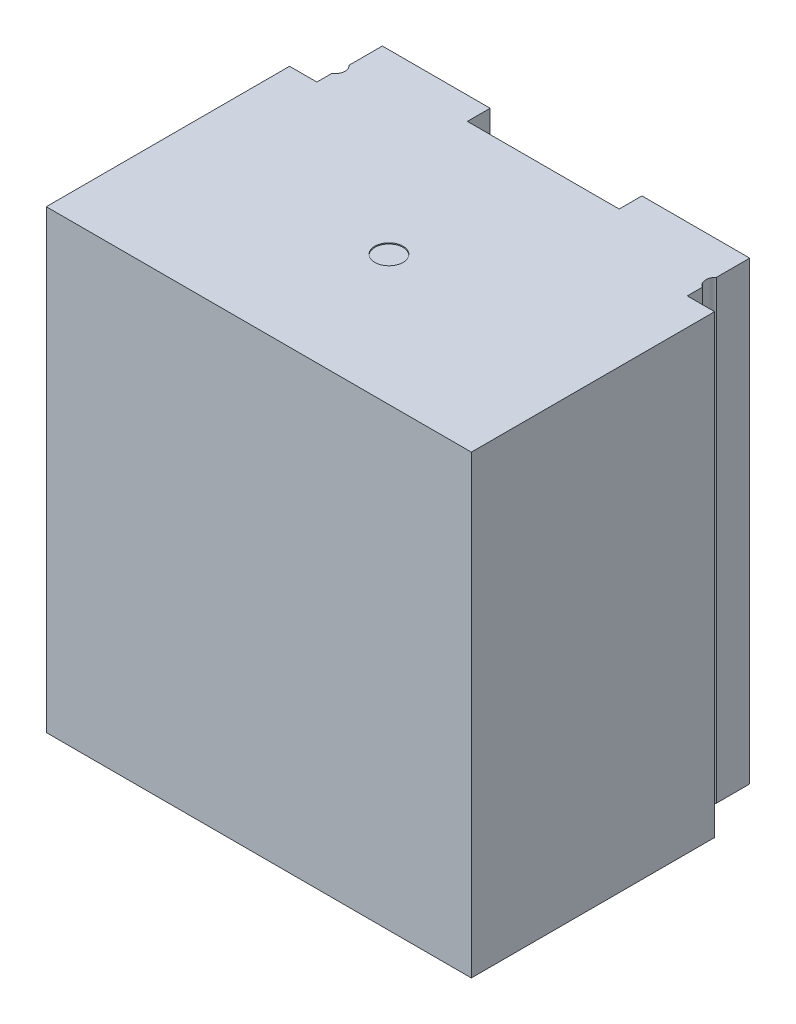
ISO-10303-21;
HEADER;
FILE_DESCRIPTION(('STEP AP214'),'2;1');
FILE_NAME('part.step','',(''),(''),'','','');
FILE_SCHEMA(('AUTOMOTIVE_DESIGN { 1 0 10303 214 1 1 1 1 }'));
ENDSEC;
DATA;
#1=APPLICATION_CONTEXT('core data for automotive mechanical design processes');
#2=APPLICATION_PROTOCOL_DEFINITION('international standard','automotive_design',2000,#1);
#3=PRODUCT_CONTEXT('',#1,'mechanical');
#4=PRODUCT('Part','Part','',(#3));
#5=PRODUCT_RELATED_PRODUCT_CATEGORY('part','',(#4));
#6=PRODUCT_DEFINITION_FORMATION('','',#4);
#7=PRODUCT_DEFINITION_CONTEXT('part definition',#1,'design');
#8=PRODUCT_DEFINITION('design','',#6,#7);
#9=PRODUCT_DEFINITION_SHAPE('','',#8);
#10=(LENGTH_UNIT() NAMED_UNIT(*) SI_UNIT(.MILLI.,.METRE.));
#11=(NAMED_UNIT(*) PLANE_ANGLE_UNIT() SI_UNIT($,.RADIAN.));
#12=(NAMED_UNIT(*) SI_UNIT($,.STERADIAN.) SOLID_ANGLE_UNIT());
#13=UNCERTAINTY_MEASURE_WITH_UNIT(LENGTH_MEASURE(1.E-05),#10,'distance_accuracy_value','');
#14=(GEOMETRIC_REPRESENTATION_CONTEXT(3) GLOBAL_UNCERTAINTY_ASSIGNED_CONTEXT((#13)) GLOBAL_UNIT_ASSIGNED_CONTEXT((#10,
#11,#12)) REPRESENTATION_CONTEXT('',''));
#15=CARTESIAN_POINT('',(0.,0.,0.));
#16=DIRECTION('',(0.,0.,1.));
#17=DIRECTION('',(1.,0.,0.));
#18=AXIS2_PLACEMENT_3D('',#15,#16,#17);
#19=CARTESIAN_POINT('',(120.904,129.54,-10.8709798683375));
#20=DIRECTION('',(-1.,0.,0.));
#21=DIRECTION('',(0.,0.,1.));
#22=AXIS2_PLACEMENT_3D('',#19,#20,#21);
#23=PLANE('',#22);
#24=DIRECTION('',(0.,0.,-1.));
#25=VECTOR('',#24,1.);
#26=CARTESIAN_POINT('',(120.904,22.86,-10.8709798683375));
#27=LINE('',#26,#25);
#28=CARTESIAN_POINT('',(120.904,22.86,6.90902013166253));
#29=VERTEX_POINT('',#28);
#30=CARTESIAN_POINT('',(120.904,22.86,-50.0709798683375));
#31=VERTEX_POINT('',#30);
#32=EDGE_CURVE('E172',#29,#31,#27,.T.);
#33=ORIENTED_EDGE('',*,*,#32,.T.);
#34=DIRECTION('',(0.,-1.,0.));
#35=VECTOR('',#34,1.);
#36=CARTESIAN_POINT('',(120.904,129.54,-50.0709798683375));
#37=LINE('',#36,#35);
#38=CARTESIAN_POINT('',(120.904,129.54,-50.0709798683375));
#39=VERTEX_POINT('',#38);
#40=EDGE_CURVE('E11',#39,#31,#37,.T.);
#41=ORIENTED_EDGE('',*,*,#40,.F.);
#42=DIRECTION('',(0.,0.,-1.));
#43=VECTOR('',#42,1.);
#44=CARTESIAN_POINT('',(120.904,129.54,-10.8709798683375));
#45=LINE('',#44,#43);
#46=CARTESIAN_POINT('',(120.904,129.54,6.90902013166253));
#47=VERTEX_POINT('',#46);
#48=EDGE_CURVE('E112',#47,#39,#45,.T.);
#49=ORIENTED_EDGE('',*,*,#48,.F.);
#50=DIRECTION('',(0.,1.,0.));
#51=VECTOR('',#50,1.);
#52=CARTESIAN_POINT('',(120.904,22.86,6.90902013166253));
#53=LINE('',#52,#51);
#54=EDGE_CURVE('E299',#29,#47,#53,.T.);
#55=ORIENTED_EDGE('',*,*,#54,.F.);
#56=EDGE_LOOP('',(#33,#41,#49,#55));
#57=FACE_BOUND('',#56,.T.);
#58=ADVANCED_FACE('F34',(#57),#23,.F.);
#59=CARTESIAN_POINT('',(120.904,129.54,-50.0709798683375));
#60=DIRECTION('',(0.,0.,1.));
#61=DIRECTION('',(1.,0.,0.));
#62=AXIS2_PLACEMENT_3D('',#59,#60,#61);
#63=PLANE('',#62);
#64=DIRECTION('',(-1.,0.,0.));
#65=VECTOR('',#64,1.);
#66=CARTESIAN_POINT('',(120.904,22.86,-50.0709798683375));
#67=LINE('',#66,#65);
#68=CARTESIAN_POINT('',(114.5032,22.86,-50.0709798683375));
#69=VERTEX_POINT('',#68);
#70=EDGE_CURVE('E174',#31,#69,#67,.T.);
#71=ORIENTED_EDGE('',*,*,#70,.T.);
#72=DIRECTION('',(0.,-1.,0.));
#73=VECTOR('',#72,1.);
#74=CARTESIAN_POINT('',(114.5032,129.54,-50.0709798683375));
#75=LINE('',#74,#73);
#76=CARTESIAN_POINT('',(114.5032,129.54,-50.0709798683375));
#77=VERTEX_POINT('',#76);
#78=EDGE_CURVE('E42',#77,#69,#75,.T.);
#79=ORIENTED_EDGE('',*,*,#78,.F.);
#80=DIRECTION('',(-1.,0.,0.));
#81=VECTOR('',#80,1.);
#82=CARTESIAN_POINT('',(120.904,129.54,-50.0709798683375));
#83=LINE('',#82,#81);
#84=EDGE_CURVE('E305',#39,#77,#83,.T.);
#85=ORIENTED_EDGE('',*,*,#84,.F.);
#86=ORIENTED_EDGE('',*,*,#40,.T.);
#87=EDGE_LOOP('',(#71,#79,#85,#86));
#88=FACE_BOUND('',#87,.T.);
#89=ADVANCED_FACE('F306',(#88),#63,.F.);
#90=CARTESIAN_POINT('',(114.5032,129.54,-50.0709798683375));
#91=DIRECTION('',(-1.,0.,0.));
#92=DIRECTION('',(0.,0.,1.));
#93=AXIS2_PLACEMENT_3D('',#90,#91,#92);
#94=PLANE('',#93);
#95=DIRECTION('',(0.,0.,-1.));
#96=VECTOR('',#95,1.);
#97=CARTESIAN_POINT('',(114.5032,22.86,-50.0709798683375));
#98=LINE('',#97,#96);
#99=CARTESIAN_POINT('',(114.5032,22.86,-53.6269798683375));
#100=VERTEX_POINT('',#99);
#101=EDGE_CURVE('E177',#69,#100,#98,.T.);
#102=ORIENTED_EDGE('',*,*,#101,.T.);
#103=DIRECTION('',(0.,-1.,0.));
#104=VECTOR('',#103,1.);
#105=CARTESIAN_POINT('',(114.5032,129.54,-53.6269798683375));
#106=LINE('',#105,#104);
#107=CARTESIAN_POINT('',(114.5032,129.54,-53.6269798683375));
#108=VERTEX_POINT('',#107);
#109=EDGE_CURVE('E225',#108,#100,#106,.T.);
#110=ORIENTED_EDGE('',*,*,#109,.F.);
#111=DIRECTION('',(0.,0.,-1.));
#112=VECTOR('',#111,1.);
#113=CARTESIAN_POINT('',(114.5032,129.54,-50.0709798683375));
#114=LINE('',#113,#112);
#115=EDGE_CURVE('E234',#77,#108,#114,.T.);
#116=ORIENTED_EDGE('',*,*,#115,.F.);
#117=ORIENTED_EDGE('',*,*,#78,.T.);
#118=EDGE_LOOP('',(#102,#110,#116,#117));
#119=FACE_BOUND('',#118,.T.);
#120=ADVANCED_FACE('F232',(#119),#94,.F.);
#121=CARTESIAN_POINT('',(115.609765974355,129.54,-55.5544180630403));
#122=DIRECTION('',(0.,-1.,0.));
#123=DIRECTION('',(0.,0.,-1.));
#124=AXIS2_PLACEMENT_3D('',#121,#122,#123);
#125=CYLINDRICAL_SURFACE('',#124,2.2225);
#126=CARTESIAN_POINT('',(115.609765974355,22.86,-55.5544180630403));
#127=DIRECTION('',(0.,-1.,0.));
#128=DIRECTION('',(0.,0.,-1.));
#129=AXIS2_PLACEMENT_3D('',#126,#127,#128);
#130=CIRCLE('',#129,2.2225);
#131=CARTESIAN_POINT('',(114.1476,22.86,-57.2282092427989));
#132=VERTEX_POINT('',#131);
#133=EDGE_CURVE('E179',#100,#132,#130,.T.);
#134=ORIENTED_EDGE('',*,*,#133,.T.);
#135=DIRECTION('',(0.,-1.,0.));
#136=VECTOR('',#135,1.);
#137=CARTESIAN_POINT('',(114.1476,129.54,-57.2282092427989));
#138=LINE('',#137,#136);
#139=CARTESIAN_POINT('',(114.1476,129.54,-57.2282092427989));
#140=VERTEX_POINT('',#139);
#141=EDGE_CURVE('E222',#140,#132,#138,.T.);
#142=ORIENTED_EDGE('',*,*,#141,.F.);
#143=CARTESIAN_POINT('',(115.609765974355,129.54,-55.5544180630403));
#144=DIRECTION('',(0.,-1.,0.));
#145=DIRECTION('',(0.,0.,-1.));
#146=AXIS2_PLACEMENT_3D('',#143,#144,#145);
#147=CIRCLE('',#146,2.2225);
#148=EDGE_CURVE('E255',#108,#140,#147,.T.);
#149=ORIENTED_EDGE('',*,*,#148,.F.);
#150=ORIENTED_EDGE('',*,*,#109,.T.);
#151=EDGE_LOOP('',(#134,#142,#149,#150));
#152=FACE_BOUND('',#151,.T.);
#153=ADVANCED_FACE('F246',(#152),#125,.F.);
#154=CARTESIAN_POINT('',(114.1476,129.54,-57.2282092427989));
#155=DIRECTION('',(-1.,0.,0.));
#156=DIRECTION('',(0.,0.,1.));
#157=AXIS2_PLACEMENT_3D('',#154,#155,#156);
#158=PLANE('',#157);
#159=DIRECTION('',(0.,0.,-1.));
#160=VECTOR('',#159,1.);
#161=CARTESIAN_POINT('',(114.1476,22.86,-57.2282092427989));
#162=LINE('',#161,#160);
#163=CARTESIAN_POINT('',(114.1476,22.86,-65.0514092427989));
#164=VERTEX_POINT('',#163);
#165=EDGE_CURVE('E181',#132,#164,#162,.T.);
#166=ORIENTED_EDGE('',*,*,#165,.T.);
#167=DIRECTION('',(0.,-1.,0.));
#168=VECTOR('',#167,1.);
#169=CARTESIAN_POINT('',(114.1476,129.54,-65.0514092427989));
#170=LINE('',#169,#168);
#171=CARTESIAN_POINT('',(114.1476,129.54,-65.0514092427989));
#172=VERTEX_POINT('',#171);
#173=EDGE_CURVE('E219',#172,#164,#170,.T.);
#174=ORIENTED_EDGE('',*,*,#173,.F.);
#175=DIRECTION('',(0.,0.,-1.));
#176=VECTOR('',#175,1.);
#177=CARTESIAN_POINT('',(114.1476,129.54,-57.2282092427989));
#178=LINE('',#177,#176);
#179=EDGE_CURVE('E252',#140,#172,#178,.T.);
#180=ORIENTED_EDGE('',*,*,#179,.F.);
#181=ORIENTED_EDGE('',*,*,#141,.T.);
#182=EDGE_LOOP('',(#166,#174,#180,#181));
#183=FACE_BOUND('',#182,.T.);
#184=ADVANCED_FACE('F250',(#183),#158,.F.);
#185=CARTESIAN_POINT('',(114.1476,129.54,-65.0514092427989));
#186=DIRECTION('',(0.,0.,1.));
#187=DIRECTION('',(1.,0.,0.));
#188=AXIS2_PLACEMENT_3D('',#185,#186,#187);
#189=PLANE('',#188);
#190=DIRECTION('',(-1.,0.,0.));
#191=VECTOR('',#190,1.);
#192=CARTESIAN_POINT('',(114.1476,22.86,-65.0514092427989));
#193=LINE('',#192,#191);
#194=CARTESIAN_POINT('',(88.9,22.86,-65.0514092427989));
#195=VERTEX_POINT('',#194);
#196=EDGE_CURVE('E183',#164,#195,#193,.T.);
#197=ORIENTED_EDGE('',*,*,#196,.T.);
#198=DIRECTION('',(0.,-1.,0.));
#199=VECTOR('',#198,1.);
#200=CARTESIAN_POINT('',(88.9,129.54,-65.0514092427989));
#201=LINE('',#200,#199);
#202=CARTESIAN_POINT('',(88.9,129.54,-65.0514092427989));
#203=VERTEX_POINT('',#202);
#204=EDGE_CURVE('E216',#203,#195,#201,.T.);
#205=ORIENTED_EDGE('',*,*,#204,.F.);
#206=DIRECTION('',(-1.,0.,0.));
#207=VECTOR('',#206,1.);
#208=CARTESIAN_POINT('',(114.1476,129.54,-65.0514092427989));
#209=LINE('',#208,#207);
#210=EDGE_CURVE('E254',#172,#203,#209,.T.);
#211=ORIENTED_EDGE('',*,*,#210,.F.);
#212=ORIENTED_EDGE('',*,*,#173,.T.);
#213=EDGE_LOOP('',(#197,#205,#211,#212));
#214=FACE_BOUND('',#213,.T.);
#215=ADVANCED_FACE('F339',(#214),#189,.F.);
#216=CARTESIAN_POINT('',(88.9,129.54,-65.0514092427989));
#217=DIRECTION('',(1.,0.,0.));
#218=DIRECTION('',(0.,0.,-1.));
#219=AXIS2_PLACEMENT_3D('',#216,#217,#218);
#220=PLANE('',#219);
#221=DIRECTION('',(0.,0.,1.));
#222=VECTOR('',#221,1.);
#223=CARTESIAN_POINT('',(88.9,22.86,-65.0514092427989));
#224=LINE('',#223,#222);
#225=CARTESIAN_POINT('',(88.9,22.86,-59.7174092427989));
#226=VERTEX_POINT('',#225);
#227=EDGE_CURVE('E185',#195,#226,#224,.T.);
#228=ORIENTED_EDGE('',*,*,#227,.T.);
#229=DIRECTION('',(0.,-1.,0.));
#230=VECTOR('',#229,1.);
#231=CARTESIAN_POINT('',(88.9,129.54,-59.7174092427989));
#232=LINE('',#231,#230);
#233=CARTESIAN_POINT('',(88.9,129.54,-59.7174092427989));
#234=VERTEX_POINT('',#233);
#235=EDGE_CURVE('E213',#234,#226,#232,.T.);
#236=ORIENTED_EDGE('',*,*,#235,.F.);
#237=DIRECTION('',(0.,0.,1.));
#238=VECTOR('',#237,1.);
#239=CARTESIAN_POINT('',(88.9,129.54,-65.0514092427989));
#240=LINE('',#239,#238);
#241=EDGE_CURVE('E257',#203,#234,#240,.T.);
#242=ORIENTED_EDGE('',*,*,#241,.F.);
#243=ORIENTED_EDGE('',*,*,#204,.T.);
#244=EDGE_LOOP('',(#228,#236,#242,#243));
#245=FACE_BOUND('',#244,.T.);
#246=ADVANCED_FACE('F342',(#245),#220,.F.);
#247=CARTESIAN_POINT('',(88.9,129.54,-59.7174092427989));
#248=DIRECTION('',(0.,0.,1.));
#249=DIRECTION('',(1.,0.,0.));
#250=AXIS2_PLACEMENT_3D('',#247,#248,#249);
#251=PLANE('',#250);
#252=DIRECTION('',(-1.,0.,0.));
#253=VECTOR('',#252,1.);
#254=CARTESIAN_POINT('',(88.9,22.86,-59.7174092427989));
#255=LINE('',#254,#253);
#256=CARTESIAN_POINT('',(53.34,22.86,-59.7174092427989));
#257=VERTEX_POINT('',#256);
#258=EDGE_CURVE('E187',#226,#257,#255,.T.);
#259=ORIENTED_EDGE('',*,*,#258,.T.);
#260=DIRECTION('',(0.,-1.,0.));
#261=VECTOR('',#260,1.);
#262=CARTESIAN_POINT('',(53.34,129.54,-59.7174092427989));
#263=LINE('',#262,#261);
#264=CARTESIAN_POINT('',(53.34,129.54,-59.7174092427989));
#265=VERTEX_POINT('',#264);
#266=EDGE_CURVE('E210',#265,#257,#263,.T.);
#267=ORIENTED_EDGE('',*,*,#266,.F.);
#268=DIRECTION('',(-1.,0.,0.));
#269=VECTOR('',#268,1.);
#270=CARTESIAN_POINT('',(88.9,129.54,-59.7174092427989));
#271=LINE('',#270,#269);
#272=EDGE_CURVE('E263',#234,#265,#271,.T.);
#273=ORIENTED_EDGE('',*,*,#272,.F.);
#274=ORIENTED_EDGE('',*,*,#235,.T.);
#275=EDGE_LOOP('',(#259,#267,#273,#274));
#276=FACE_BOUND('',#275,.T.);
#277=ADVANCED_FACE('F346',(#276),#251,.F.);
#278=CARTESIAN_POINT('',(53.34,129.54,-59.7174092427989));
#279=DIRECTION('',(-1.,0.,0.));
#280=DIRECTION('',(0.,0.,1.));
#281=AXIS2_PLACEMENT_3D('',#278,#279,#280);
#282=PLANE('',#281);
#283=DIRECTION('',(0.,0.,-1.));
#284=VECTOR('',#283,1.);
#285=CARTESIAN_POINT('',(53.34,22.86,-59.7174092427989));
#286=LINE('',#285,#284);
#287=CARTESIAN_POINT('',(53.34,22.86,-65.0514092427989));
#288=VERTEX_POINT('',#287);
#289=EDGE_CURVE('E189',#257,#288,#286,.T.);
#290=ORIENTED_EDGE('',*,*,#289,.T.);
#291=DIRECTION('',(0.,-1.,0.));
#292=VECTOR('',#291,1.);
#293=CARTESIAN_POINT('',(53.34,129.54,-65.0514092427989));
#294=LINE('',#293,#292);
#295=CARTESIAN_POINT('',(53.34,129.54,-65.0514092427989));
#296=VERTEX_POINT('',#295);
#297=EDGE_CURVE('E207',#296,#288,#294,.T.);
#298=ORIENTED_EDGE('',*,*,#297,.F.);
#299=DIRECTION('',(0.,0.,-1.));
#300=VECTOR('',#299,1.);
#301=CARTESIAN_POINT('',(53.34,129.54,-59.7174092427989));
#302=LINE('',#301,#300);
#303=EDGE_CURVE('E265',#265,#296,#302,.T.);
#304=ORIENTED_EDGE('',*,*,#303,.F.);
#305=ORIENTED_EDGE('',*,*,#266,.T.);
#306=EDGE_LOOP('',(#290,#298,#304,#305));
#307=FACE_BOUND('',#306,.T.);
#308=ADVANCED_FACE('F350',(#307),#282,.F.);
#309=CARTESIAN_POINT('',(53.34,129.54,-65.0514092427989));
#310=DIRECTION('',(0.,0.,1.));
#311=DIRECTION('',(1.,0.,0.));
#312=AXIS2_PLACEMENT_3D('',#309,#310,#311);
#313=PLANE('',#312);
#314=DIRECTION('',(-1.,0.,0.));
#315=VECTOR('',#314,1.);
#316=CARTESIAN_POINT('',(53.34,22.86,-65.0514092427989));
#317=LINE('',#316,#315);
#318=CARTESIAN_POINT('',(28.0924,22.86,-65.0514092427989));
#319=VERTEX_POINT('',#318);
#320=EDGE_CURVE('E191',#288,#319,#317,.T.);
#321=ORIENTED_EDGE('',*,*,#320,.T.);
#322=DIRECTION('',(0.,-1.,0.));
#323=VECTOR('',#322,1.);
#324=CARTESIAN_POINT('',(28.0924,129.54,-65.0514092427989));
#325=LINE('',#324,#323);
#326=CARTESIAN_POINT('',(28.0924,129.54,-65.0514092427989));
#327=VERTEX_POINT('',#326);
#328=EDGE_CURVE('E204',#327,#319,#325,.T.);
#329=ORIENTED_EDGE('',*,*,#328,.F.);
#330=DIRECTION('',(-1.,0.,0.));
#331=VECTOR('',#330,1.);
#332=CARTESIAN_POINT('',(53.34,129.54,-65.0514092427989));
#333=LINE('',#332,#331);
#334=EDGE_CURVE('E267',#296,#327,#333,.T.);
#335=ORIENTED_EDGE('',*,*,#334,.F.);
#336=ORIENTED_EDGE('',*,*,#297,.T.);
#337=EDGE_LOOP('',(#321,#329,#335,#336));
#338=FACE_BOUND('',#337,.T.);
#339=ADVANCED_FACE('F273',(#338),#313,.F.);
#340=CARTESIAN_POINT('',(28.0924,129.54,-65.0514092427989));
#341=DIRECTION('',(1.,0.,0.));
#342=DIRECTION('',(0.,0.,-1.));
#343=AXIS2_PLACEMENT_3D('',#340,#341,#342);
#344=PLANE('',#343);
#345=DIRECTION('',(0.,0.,1.));
#346=VECTOR('',#345,1.);
#347=CARTESIAN_POINT('',(28.0924,22.86,-65.0514092427989));
#348=LINE('',#347,#346);
#349=CARTESIAN_POINT('',(28.0924,22.86,-57.2282092427989));
#350=VERTEX_POINT('',#349);
#351=EDGE_CURVE('E193',#319,#350,#348,.T.);
#352=ORIENTED_EDGE('',*,*,#351,.T.);
#353=DIRECTION('',(0.,-1.,0.));
#354=VECTOR('',#353,1.);
#355=CARTESIAN_POINT('',(28.0924,129.54,-57.2282092427989));
#356=LINE('',#355,#354);
#357=CARTESIAN_POINT('',(28.0924,129.54,-57.2282092427989));
#358=VERTEX_POINT('',#357);
#359=EDGE_CURVE('E161',#358,#350,#356,.T.);
#360=ORIENTED_EDGE('',*,*,#359,.F.);
#361=DIRECTION('',(0.,0.,1.));
#362=VECTOR('',#361,1.);
#363=CARTESIAN_POINT('',(28.0924,129.54,-65.0514092427989));
#364=LINE('',#363,#362);
#365=EDGE_CURVE('E152',#327,#358,#364,.T.);
#366=ORIENTED_EDGE('',*,*,#365,.F.);
#367=ORIENTED_EDGE('',*,*,#328,.T.);
#368=EDGE_LOOP('',(#352,#360,#366,#367));
#369=FACE_BOUND('',#368,.T.);
#370=ADVANCED_FACE('F277',(#369),#344,.F.);
#371=CARTESIAN_POINT('',(26.6302340256448,129.54,-55.5544180630403));
#372=DIRECTION('',(0.,-1.,0.));
#373=DIRECTION('',(0.,0.,-1.));
#374=AXIS2_PLACEMENT_3D('',#371,#372,#373);
#375=CYLINDRICAL_SURFACE('',#374,2.2225);
#376=CARTESIAN_POINT('',(26.6302340256448,22.86,-55.5544180630403));
#377=DIRECTION('',(0.,-1.,0.));
#378=DIRECTION('',(0.,0.,1.));
#379=AXIS2_PLACEMENT_3D('',#376,#377,#378);
#380=CIRCLE('',#379,2.2225);
#381=CARTESIAN_POINT('',(27.7368,22.86,-53.6269798683375));
#382=VERTEX_POINT('',#381);
#383=EDGE_CURVE('E160',#350,#382,#380,.T.);
#384=ORIENTED_EDGE('',*,*,#383,.T.);
#385=DIRECTION('',(0.,-1.,0.));
#386=VECTOR('',#385,1.);
#387=CARTESIAN_POINT('',(27.7368,129.54,-53.6269798683375));
#388=LINE('',#387,#386);
#389=CARTESIAN_POINT('',(27.7368,129.54,-53.6269798683375));
#390=VERTEX_POINT('',#389);
#391=EDGE_CURVE('E157',#390,#382,#388,.T.);
#392=ORIENTED_EDGE('',*,*,#391,.F.);
#393=CARTESIAN_POINT('',(26.6302340256448,129.54,-55.5544180630403));
#394=DIRECTION('',(0.,-1.,0.));
#395=DIRECTION('',(0.,0.,1.));
#396=AXIS2_PLACEMENT_3D('',#393,#394,#395);
#397=CIRCLE('',#396,2.2225);
#398=EDGE_CURVE('E146',#358,#390,#397,.T.);
#399=ORIENTED_EDGE('',*,*,#398,.F.);
#400=ORIENTED_EDGE('',*,*,#359,.T.);
#401=EDGE_LOOP('',(#384,#392,#399,#400));
#402=FACE_BOUND('',#401,.T.);
#403=ADVANCED_FACE('F158',(#402),#375,.F.);
#404=CARTESIAN_POINT('',(27.7368,129.54,-50.0709798683375));
#405=DIRECTION('',(1.,0.,0.));
#406=DIRECTION('',(0.,0.,-1.));
#407=AXIS2_PLACEMENT_3D('',#404,#405,#406);
#408=PLANE('',#407);
#409=DIRECTION('',(0.,0.,1.));
#410=VECTOR('',#409,1.);
#411=CARTESIAN_POINT('',(27.7368,22.86,-50.0709798683375));
#412=LINE('',#411,#410);
#413=CARTESIAN_POINT('',(27.7368,22.86,-50.0709798683375));
#414=VERTEX_POINT('',#413);
#415=EDGE_CURVE('E98',#382,#414,#412,.T.);
#416=ORIENTED_EDGE('',*,*,#415,.T.);
#417=DIRECTION('',(0.,-1.,0.));
#418=VECTOR('',#417,1.);
#419=CARTESIAN_POINT('',(27.7368,129.54,-50.0709798683375));
#420=LINE('',#419,#418);
#421=CARTESIAN_POINT('',(27.7368,129.54,-50.0709798683375));
#422=VERTEX_POINT('',#421);
#423=EDGE_CURVE('E162',#422,#414,#420,.T.);
#424=ORIENTED_EDGE('',*,*,#423,.F.);
#425=DIRECTION('',(0.,0.,1.));
#426=VECTOR('',#425,1.);
#427=CARTESIAN_POINT('',(27.7368,129.54,-50.0709798683375));
#428=LINE('',#427,#426);
#429=EDGE_CURVE('E150',#390,#422,#428,.T.);
#430=ORIENTED_EDGE('',*,*,#429,.F.);
#431=ORIENTED_EDGE('',*,*,#391,.T.);
#432=EDGE_LOOP('',(#416,#424,#430,#431));
#433=FACE_BOUND('',#432,.T.);
#434=ADVANCED_FACE('F164',(#433),#408,.F.);
#435=CARTESIAN_POINT('',(21.336,129.54,-50.0709798683375));
#436=DIRECTION('',(0.,0.,1.));
#437=DIRECTION('',(1.,0.,0.));
#438=AXIS2_PLACEMENT_3D('',#435,#436,#437);
#439=PLANE('',#438);
#440=DIRECTION('',(-1.,0.,0.));
#441=VECTOR('',#440,1.);
#442=CARTESIAN_POINT('',(21.336,22.86,-50.0709798683375));
#443=LINE('',#442,#441);
#444=CARTESIAN_POINT('',(21.336,22.86,-50.0709798683375));
#445=VERTEX_POINT('',#444);
#446=EDGE_CURVE('E104',#414,#445,#443,.T.);
#447=ORIENTED_EDGE('',*,*,#446,.T.);
#448=DIRECTION('',(0.,-1.,0.));
#449=VECTOR('',#448,1.);
#450=CARTESIAN_POINT('',(21.336,129.54,-50.0709798683375));
#451=LINE('',#450,#449);
#452=CARTESIAN_POINT('',(21.336,129.54,-50.0709798683375));
#453=VERTEX_POINT('',#452);
#454=EDGE_CURVE('E171',#453,#445,#451,.T.);
#455=ORIENTED_EDGE('',*,*,#454,.F.);
#456=DIRECTION('',(-1.,0.,0.));
#457=VECTOR('',#456,1.);
#458=CARTESIAN_POINT('',(21.336,129.54,-50.0709798683375));
#459=LINE('',#458,#457);
#460=EDGE_CURVE('E50',#422,#453,#459,.T.);
#461=ORIENTED_EDGE('',*,*,#460,.F.);
#462=ORIENTED_EDGE('',*,*,#423,.T.);
#463=EDGE_LOOP('',(#447,#455,#461,#462));
#464=FACE_BOUND('',#463,.T.);
#465=ADVANCED_FACE('F363',(#464),#439,.F.);
#466=CARTESIAN_POINT('',(21.336,129.54,-10.8709798683375));
#467=DIRECTION('',(1.,0.,0.));
#468=DIRECTION('',(0.,0.,-1.));
#469=AXIS2_PLACEMENT_3D('',#466,#467,#468);
#470=PLANE('',#469);
#471=DIRECTION('',(0.,0.,1.));
#472=VECTOR('',#471,1.);
#473=CARTESIAN_POINT('',(21.336,22.86,-10.8709798683375));
#474=LINE('',#473,#472);
#475=CARTESIAN_POINT('',(21.336,22.86,6.90902013166253));
#476=VERTEX_POINT('',#475);
#477=EDGE_CURVE('E198',#445,#476,#474,.T.);
#478=ORIENTED_EDGE('',*,*,#477,.T.);
#479=DIRECTION('',(0.,-1.,0.));
#480=VECTOR('',#479,1.);
#481=CARTESIAN_POINT('',(21.336,22.86,6.90902013166253));
#482=LINE('',#481,#480);
#483=CARTESIAN_POINT('',(21.336,129.54,6.90902013166253));
#484=VERTEX_POINT('',#483);
#485=EDGE_CURVE('E288',#484,#476,#482,.T.);
#486=ORIENTED_EDGE('',*,*,#485,.F.);
#487=DIRECTION('',(0.,0.,1.));
#488=VECTOR('',#487,1.);
#489=CARTESIAN_POINT('',(21.336,129.54,-10.8709798683375));
#490=LINE('',#489,#488);
#491=EDGE_CURVE('E166',#453,#484,#490,.T.);
#492=ORIENTED_EDGE('',*,*,#491,.F.);
#493=ORIENTED_EDGE('',*,*,#454,.T.);
#494=EDGE_LOOP('',(#478,#486,#492,#493));
#495=FACE_BOUND('',#494,.T.);
#496=ADVANCED_FACE('F286',(#495),#470,.F.);
#497=CARTESIAN_POINT('',(115.609765974355,129.54,-55.5544180630403));
#498=DIRECTION('',(0.,-1.,0.));
#499=DIRECTION('',(0.,0.,-1.));
#500=AXIS2_PLACEMENT_3D('',#497,#498,#499);
#501=PLANE('',#500);
#502=CARTESIAN_POINT('',(71.12,129.54,-23.5709798683375));
#503=DIRECTION('',(0.,-1.,0.));
#504=DIRECTION('',(0.,0.,-1.));
#505=AXIS2_PLACEMENT_3D('',#502,#503,#504);
#506=CIRCLE('',#505,3.302);
#507=CARTESIAN_POINT('',(71.12,129.54,-26.8729798683375));
#508=VERTEX_POINT('',#507);
#509=EDGE_CURVE('E310',#508,#508,#506,.T.);
#510=ORIENTED_EDGE('',*,*,#509,.T.);
#511=EDGE_LOOP('',(#510));
#512=FACE_BOUND('',#511,.T.);
#513=ORIENTED_EDGE('',*,*,#491,.T.);
#514=DIRECTION('',(-1.,0.,0.));
#515=VECTOR('',#514,1.);
#516=CARTESIAN_POINT('',(21.336,129.54,6.90902013166253));
#517=LINE('',#516,#515);
#518=EDGE_CURVE('E175',#47,#484,#517,.T.);
#519=ORIENTED_EDGE('',*,*,#518,.F.);
#520=ORIENTED_EDGE('',*,*,#48,.T.);
#521=ORIENTED_EDGE('',*,*,#84,.T.);
#522=ORIENTED_EDGE('',*,*,#115,.T.);
#523=ORIENTED_EDGE('',*,*,#148,.T.);
#524=ORIENTED_EDGE('',*,*,#179,.T.);
#525=ORIENTED_EDGE('',*,*,#210,.T.);
#526=ORIENTED_EDGE('',*,*,#241,.T.);
#527=ORIENTED_EDGE('',*,*,#272,.T.);
#528=ORIENTED_EDGE('',*,*,#303,.T.);
#529=ORIENTED_EDGE('',*,*,#334,.T.);
#530=ORIENTED_EDGE('',*,*,#365,.T.);
#531=ORIENTED_EDGE('',*,*,#398,.T.);
#532=ORIENTED_EDGE('',*,*,#429,.T.);
#533=ORIENTED_EDGE('',*,*,#460,.T.);
#534=EDGE_LOOP('',(#513,#519,#520,#521,#522,#523,#524,#525,#526,#527,#528,#529,#530,#531,#532,#533));
#535=FACE_BOUND('',#534,.T.);
#536=ADVANCED_FACE('F148',(#512,#535),#501,.F.);
#537=CARTESIAN_POINT('',(115.609765974355,22.86,-55.5544180630403));
#538=DIRECTION('',(0.,-1.,0.));
#539=DIRECTION('',(0.,0.,-1.));
#540=AXIS2_PLACEMENT_3D('',#537,#538,#539);
#541=PLANE('',#540);
#542=ORIENTED_EDGE('',*,*,#32,.F.);
#543=DIRECTION('',(1.,0.,0.));
#544=VECTOR('',#543,1.);
#545=CARTESIAN_POINT('',(21.336,22.86,6.90902013166253));
#546=LINE('',#545,#544);
#547=EDGE_CURVE('E282',#476,#29,#546,.T.);
#548=ORIENTED_EDGE('',*,*,#547,.F.);
#549=ORIENTED_EDGE('',*,*,#477,.F.);
#550=ORIENTED_EDGE('',*,*,#446,.F.);
#551=ORIENTED_EDGE('',*,*,#415,.F.);
#552=ORIENTED_EDGE('',*,*,#383,.F.);
#553=ORIENTED_EDGE('',*,*,#351,.F.);
#554=ORIENTED_EDGE('',*,*,#320,.F.);
#555=ORIENTED_EDGE('',*,*,#289,.F.);
#556=ORIENTED_EDGE('',*,*,#258,.F.);
#557=ORIENTED_EDGE('',*,*,#227,.F.);
#558=ORIENTED_EDGE('',*,*,#196,.F.);
#559=ORIENTED_EDGE('',*,*,#165,.F.);
#560=ORIENTED_EDGE('',*,*,#133,.F.);
#561=ORIENTED_EDGE('',*,*,#101,.F.);
#562=ORIENTED_EDGE('',*,*,#70,.F.);
#563=EDGE_LOOP('',(#542,#548,#549,#550,#551,#552,#553,#554,#555,#556,#557,#558,#559,#560,#561,#562));
#564=FACE_BOUND('',#563,.T.);
#565=ADVANCED_FACE('F241',(#564),#541,.T.);
#566=CARTESIAN_POINT('',(0.,0.,6.90902013166253));
#567=DIRECTION('',(0.,0.,-1.));
#568=DIRECTION('',(-1.,0.,0.));
#569=AXIS2_PLACEMENT_3D('',#566,#567,#568);
#570=PLANE('',#569);
#571=ORIENTED_EDGE('',*,*,#485,.T.);
#572=ORIENTED_EDGE('',*,*,#547,.T.);
#573=ORIENTED_EDGE('',*,*,#54,.T.);
#574=ORIENTED_EDGE('',*,*,#518,.T.);
#575=EDGE_LOOP('',(#571,#572,#573,#574));
#576=FACE_BOUND('',#575,.T.);
#577=ADVANCED_FACE('F298',(#576),#570,.F.);
#578=CARTESIAN_POINT('',(71.12,129.286,-23.5709798683375));
#579=DIRECTION('',(0.,1.,0.));
#580=DIRECTION('',(0.,0.,1.));
#581=AXIS2_PLACEMENT_3D('',#578,#579,#580);
#582=CYLINDRICAL_SURFACE('',#581,3.302);
#583=CARTESIAN_POINT('',(71.12,129.286,-23.5709798683375));
#584=DIRECTION('',(0.,-1.,0.));
#585=DIRECTION('',(0.,0.,-1.));
#586=AXIS2_PLACEMENT_3D('',#583,#584,#585);
#587=CIRCLE('',#586,3.302);
#588=CARTESIAN_POINT('',(71.12,129.286,-26.8729798683375));
#589=VERTEX_POINT('',#588);
#590=EDGE_CURVE('E307',#589,#589,#587,.T.);
#591=ORIENTED_EDGE('',*,*,#590,.T.);
#592=EDGE_LOOP('',(#591));
#593=FACE_BOUND('',#592,.T.);
#594=ORIENTED_EDGE('',*,*,#509,.F.);
#595=EDGE_LOOP('',(#594));
#596=FACE_BOUND('',#595,.T.);
#597=ADVANCED_FACE('F316',(#593,#596),#582,.F.);
#598=CARTESIAN_POINT('',(71.12,129.286,-23.5709798683375));
#599=DIRECTION('',(0.,-1.,0.));
#600=DIRECTION('',(0.,0.,-1.));
#601=AXIS2_PLACEMENT_3D('',#598,#599,#600);
#602=PLANE('',#601);
#603=ORIENTED_EDGE('',*,*,#590,.F.);
#604=EDGE_LOOP('',(#603));
#605=FACE_BOUND('',#604,.T.);
#606=ADVANCED_FACE('F319',(#605),#602,.F.);
#607=CLOSED_SHELL('',(#58,#89,#120,#153,#184,#215,#246,#277,#308,#339,#370,#403,#434,#465,#496,
#536,#565,#577,#597,#606));
#608=MANIFOLD_SOLID_BREP('B2',#607);
#609=ADVANCED_BREP_SHAPE_REPRESENTATION('',(#18,#608),#14);
#610=SHAPE_DEFINITION_REPRESENTATION(#9,#609);
ENDSEC;
END-ISO-10303-21;
